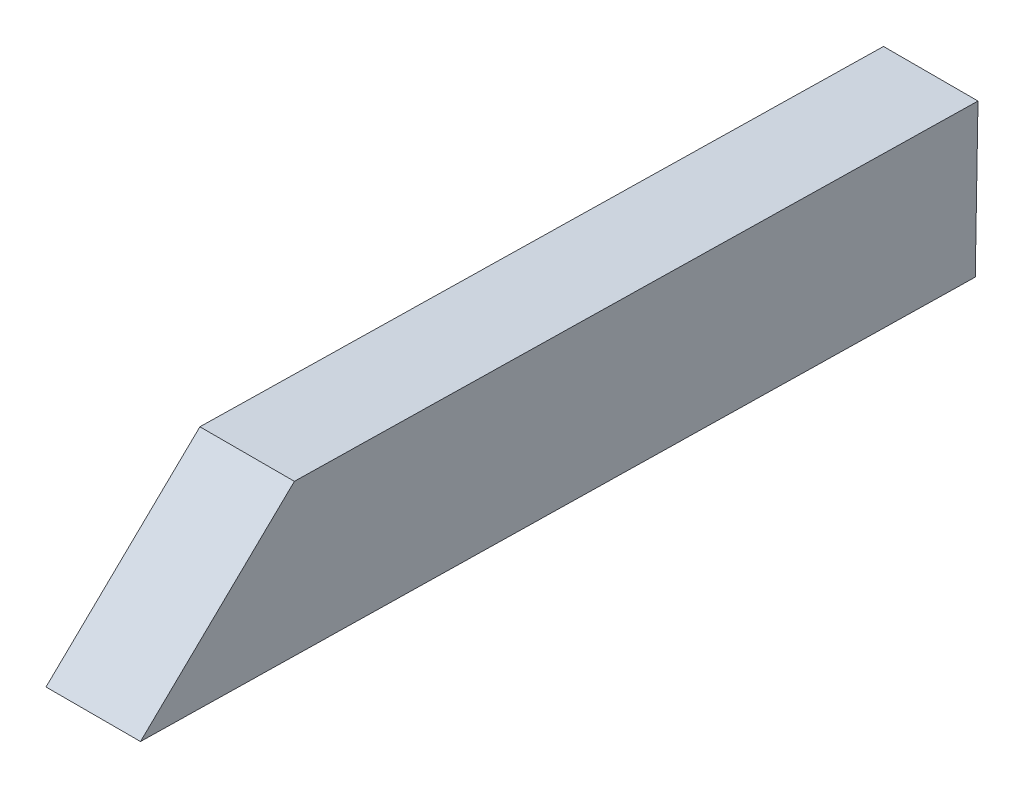
ISO-10303-21;
HEADER;
FILE_DESCRIPTION(('STEP AP214'),'2;1');
FILE_NAME('part.step','',(''),(''),'','','');
FILE_SCHEMA(('AUTOMOTIVE_DESIGN { 1 0 10303 214 1 1 1 1 }'));
ENDSEC;
DATA;
#1=APPLICATION_CONTEXT('core data for automotive mechanical design processes');
#2=APPLICATION_PROTOCOL_DEFINITION('international standard','automotive_design',2000,#1);
#3=PRODUCT_CONTEXT('',#1,'mechanical');
#4=PRODUCT('Part','Part','',(#3));
#5=PRODUCT_RELATED_PRODUCT_CATEGORY('part','',(#4));
#6=PRODUCT_DEFINITION_FORMATION('','',#4);
#7=PRODUCT_DEFINITION_CONTEXT('part definition',#1,'design');
#8=PRODUCT_DEFINITION('design','',#6,#7);
#9=PRODUCT_DEFINITION_SHAPE('','',#8);
#10=(LENGTH_UNIT() NAMED_UNIT(*) SI_UNIT(.MILLI.,.METRE.));
#11=(NAMED_UNIT(*) PLANE_ANGLE_UNIT() SI_UNIT($,.RADIAN.));
#12=(NAMED_UNIT(*) SI_UNIT($,.STERADIAN.) SOLID_ANGLE_UNIT());
#13=UNCERTAINTY_MEASURE_WITH_UNIT(LENGTH_MEASURE(1.E-05),#10,'distance_accuracy_value','');
#14=(GEOMETRIC_REPRESENTATION_CONTEXT(3) GLOBAL_UNCERTAINTY_ASSIGNED_CONTEXT((#13)) GLOBAL_UNIT_ASSIGNED_CONTEXT((#10,
#11,#12)) REPRESENTATION_CONTEXT('',''));
#15=CARTESIAN_POINT('',(0.,0.,0.));
#16=DIRECTION('',(0.,0.,1.));
#17=DIRECTION('',(1.,0.,0.));
#18=AXIS2_PLACEMENT_3D('',#15,#16,#17);
#19=CARTESIAN_POINT('',(669.607224889476,1094.12166579891,1257.51853904974));
#20=DIRECTION('',(1.,0.,0.));
#21=DIRECTION('',(0.,1.,0.));
#22=AXIS2_PLACEMENT_3D('',#19,#20,#21);
#23=PLANE('',#22);
#24=DIRECTION('',(0.,0.0181897950048834,0.999834551992319));
#25=VECTOR('',#24,1.);
#26=CARTESIAN_POINT('',(669.607224889476,1089.04250627479,1257.61094320836));
#27=LINE('',#26,#25);
#28=CARTESIAN_POINT('',(669.607224889476,1089.04250627479,1257.61094320836));
#29=VERTEX_POINT('',#28);
#30=CARTESIAN_POINT('',(669.607224889476,1089.55282492054,1285.66151851226));
#31=VERTEX_POINT('',#30);
#32=EDGE_CURVE('E107',#29,#31,#27,.T.);
#33=ORIENTED_EDGE('',*,*,#32,.T.);
#34=DIRECTION('',(0.,0.694127664382041,-0.719851919174724));
#35=VECTOR('',#34,1.);
#36=CARTESIAN_POINT('',(669.607224889476,1094.53958028604,1280.48995482952));
#37=LINE('',#36,#35);
#38=CARTESIAN_POINT('',(669.607224889476,1094.53958028604,1280.48995482952));
#39=VERTEX_POINT('',#38);
#40=EDGE_CURVE('E11',#31,#39,#37,.T.);
#41=ORIENTED_EDGE('',*,*,#40,.T.);
#42=DIRECTION('',(0.,0.0181897950048834,0.999834551992319));
#43=VECTOR('',#42,1.);
#44=CARTESIAN_POINT('',(669.607224889476,1094.12166579891,1257.51853904974));
#45=LINE('',#44,#43);
#46=CARTESIAN_POINT('',(669.607224889476,1094.12166579891,1257.51853904974));
#47=VERTEX_POINT('',#46);
#48=EDGE_CURVE('E90',#47,#39,#45,.T.);
#49=ORIENTED_EDGE('',*,*,#48,.F.);
#50=DIRECTION('',(0.,-0.999834551992318,0.0181897950048905));
#51=VECTOR('',#50,1.);
#52=CARTESIAN_POINT('',(669.607224889476,1094.12166579891,1257.51853904974));
#53=LINE('',#52,#51);
#54=EDGE_CURVE('E99',#47,#29,#53,.T.);
#55=ORIENTED_EDGE('',*,*,#54,.T.);
#56=EDGE_LOOP('',(#33,#41,#49,#55));
#57=FACE_BOUND('',#56,.T.);
#58=ADVANCED_FACE('F41',(#57),#23,.F.);
#59=CARTESIAN_POINT('',(672.782224889476,1094.12166579891,1257.51853904974));
#60=DIRECTION('',(-1.,0.,0.));
#61=DIRECTION('',(0.,-1.,0.));
#62=AXIS2_PLACEMENT_3D('',#59,#60,#61);
#63=PLANE('',#62);
#64=DIRECTION('',(0.,-0.0181897950048913,-0.999834551992318));
#65=VECTOR('',#64,1.);
#66=CARTESIAN_POINT('',(672.782224889476,1094.12166579891,1257.51853904974));
#67=LINE('',#66,#65);
#68=CARTESIAN_POINT('',(672.782224889476,1094.53958028604,1280.48995482952));
#69=VERTEX_POINT('',#68);
#70=CARTESIAN_POINT('',(672.782224889476,1094.12166579891,1257.51853904974));
#71=VERTEX_POINT('',#70);
#72=EDGE_CURVE('E82',#69,#71,#67,.T.);
#73=ORIENTED_EDGE('',*,*,#72,.F.);
#74=DIRECTION('',(0.,-0.694127664382041,0.719851919174724));
#75=VECTOR('',#74,1.);
#76=CARTESIAN_POINT('',(672.782224889476,1094.53958028604,1280.48995482952));
#77=LINE('',#76,#75);
#78=CARTESIAN_POINT('',(672.782224889476,1089.55282492054,1285.66151851226));
#79=VERTEX_POINT('',#78);
#80=EDGE_CURVE('E50',#69,#79,#77,.T.);
#81=ORIENTED_EDGE('',*,*,#80,.T.);
#82=DIRECTION('',(0.,-0.0181897950048913,-0.999834551992318));
#83=VECTOR('',#82,1.);
#84=CARTESIAN_POINT('',(672.782224889476,1089.04250627479,1257.61094320836));
#85=LINE('',#84,#83);
#86=CARTESIAN_POINT('',(672.782224889476,1089.04250627479,1257.61094320836));
#87=VERTEX_POINT('',#86);
#88=EDGE_CURVE('E96',#79,#87,#85,.T.);
#89=ORIENTED_EDGE('',*,*,#88,.T.);
#90=DIRECTION('',(0.,-0.999834551992318,0.0181897950048905));
#91=VECTOR('',#90,1.);
#92=CARTESIAN_POINT('',(672.782224889476,1094.12166579891,1257.51853904974));
#93=LINE('',#92,#91);
#94=EDGE_CURVE('E93',#71,#87,#93,.T.);
#95=ORIENTED_EDGE('',*,*,#94,.F.);
#96=EDGE_LOOP('',(#73,#81,#89,#95));
#97=FACE_BOUND('',#96,.T.);
#98=ADVANCED_FACE('F94',(#97),#63,.F.);
#99=CARTESIAN_POINT('',(669.607224889476,1094.12166579891,1257.51853904974));
#100=DIRECTION('',(0.,0.0181897950048905,0.999834551992318));
#101=DIRECTION('',(0.,-0.999834551992318,0.0181897950048905));
#102=AXIS2_PLACEMENT_3D('',#99,#100,#101);
#103=PLANE('',#102);
#104=DIRECTION('',(-1.,0.,0.));
#105=VECTOR('',#104,1.);
#106=CARTESIAN_POINT('',(669.607224889476,1089.04250627479,1257.61094320836));
#107=LINE('',#106,#105);
#108=EDGE_CURVE('E112',#87,#29,#107,.T.);
#109=ORIENTED_EDGE('',*,*,#108,.T.);
#110=ORIENTED_EDGE('',*,*,#54,.F.);
#111=DIRECTION('',(-1.,0.,0.));
#112=VECTOR('',#111,1.);
#113=CARTESIAN_POINT('',(669.607224889476,1094.12166579891,1257.51853904974));
#114=LINE('',#113,#112);
#115=EDGE_CURVE('E86',#71,#47,#114,.T.);
#116=ORIENTED_EDGE('',*,*,#115,.F.);
#117=ORIENTED_EDGE('',*,*,#94,.T.);
#118=EDGE_LOOP('',(#109,#110,#116,#117));
#119=FACE_BOUND('',#118,.T.);
#120=ADVANCED_FACE('F101',(#119),#103,.F.);
#121=CARTESIAN_POINT('',(0.,1070.88943526712,-19.4824826383416));
#122=DIRECTION('',(0.,0.999834551992319,-0.0181897950048834));
#123=DIRECTION('',(0.,0.0181897950048834,0.999834551992319));
#124=AXIS2_PLACEMENT_3D('',#121,#122,#123);
#125=PLANE('',#124);
#126=ORIENTED_EDGE('',*,*,#48,.T.);
#127=DIRECTION('',(1.,0.,0.));
#128=VECTOR('',#127,1.);
#129=CARTESIAN_POINT('',(672.782224889476,1094.53958028604,1280.48995482952));
#130=LINE('',#129,#128);
#131=EDGE_CURVE('E88',#39,#69,#130,.T.);
#132=ORIENTED_EDGE('',*,*,#131,.T.);
#133=ORIENTED_EDGE('',*,*,#72,.T.);
#134=ORIENTED_EDGE('',*,*,#115,.T.);
#135=EDGE_LOOP('',(#126,#132,#133,#134));
#136=FACE_BOUND('',#135,.T.);
#137=ADVANCED_FACE('F84',(#136),#125,.T.);
#138=CARTESIAN_POINT('',(0.,1065.810275743,-19.3900784797168));
#139=DIRECTION('',(0.,0.999834551992319,-0.0181897950048834));
#140=DIRECTION('',(0.,0.0181897950048834,0.999834551992319));
#141=AXIS2_PLACEMENT_3D('',#138,#139,#140);
#142=PLANE('',#141);
#143=ORIENTED_EDGE('',*,*,#32,.F.);
#144=ORIENTED_EDGE('',*,*,#108,.F.);
#145=ORIENTED_EDGE('',*,*,#88,.F.);
#146=DIRECTION('',(1.,0.,0.));
#147=VECTOR('',#146,1.);
#148=CARTESIAN_POINT('',(669.607224889476,1089.55282492054,1285.66151851226));
#149=LINE('',#148,#147);
#150=EDGE_CURVE('E109',#31,#79,#149,.T.);
#151=ORIENTED_EDGE('',*,*,#150,.F.);
#152=EDGE_LOOP('',(#143,#144,#145,#151));
#153=FACE_BOUND('',#152,.T.);
#154=ADVANCED_FACE('F116',(#153),#142,.F.);
#155=CARTESIAN_POINT('',(0.,1094.53958028604,1280.48995482952));
#156=DIRECTION('',(0.,0.719851919174724,0.694127664382041));
#157=DIRECTION('',(-1.,0.,0.));
#158=AXIS2_PLACEMENT_3D('',#155,#156,#157);
#159=PLANE('',#158);
#160=ORIENTED_EDGE('',*,*,#40,.F.);
#161=ORIENTED_EDGE('',*,*,#150,.T.);
#162=ORIENTED_EDGE('',*,*,#80,.F.);
#163=ORIENTED_EDGE('',*,*,#131,.F.);
#164=EDGE_LOOP('',(#160,#161,#162,#163));
#165=FACE_BOUND('',#164,.T.);
#166=ADVANCED_FACE('F44',(#165),#159,.T.);
#167=CLOSED_SHELL('',(#58,#98,#120,#137,#154,#166));
#168=MANIFOLD_SOLID_BREP('B2',#167);
#169=ADVANCED_BREP_SHAPE_REPRESENTATION('',(#18,#168),#14);
#170=SHAPE_DEFINITION_REPRESENTATION(#9,#169);
ENDSEC;
END-ISO-10303-21;
